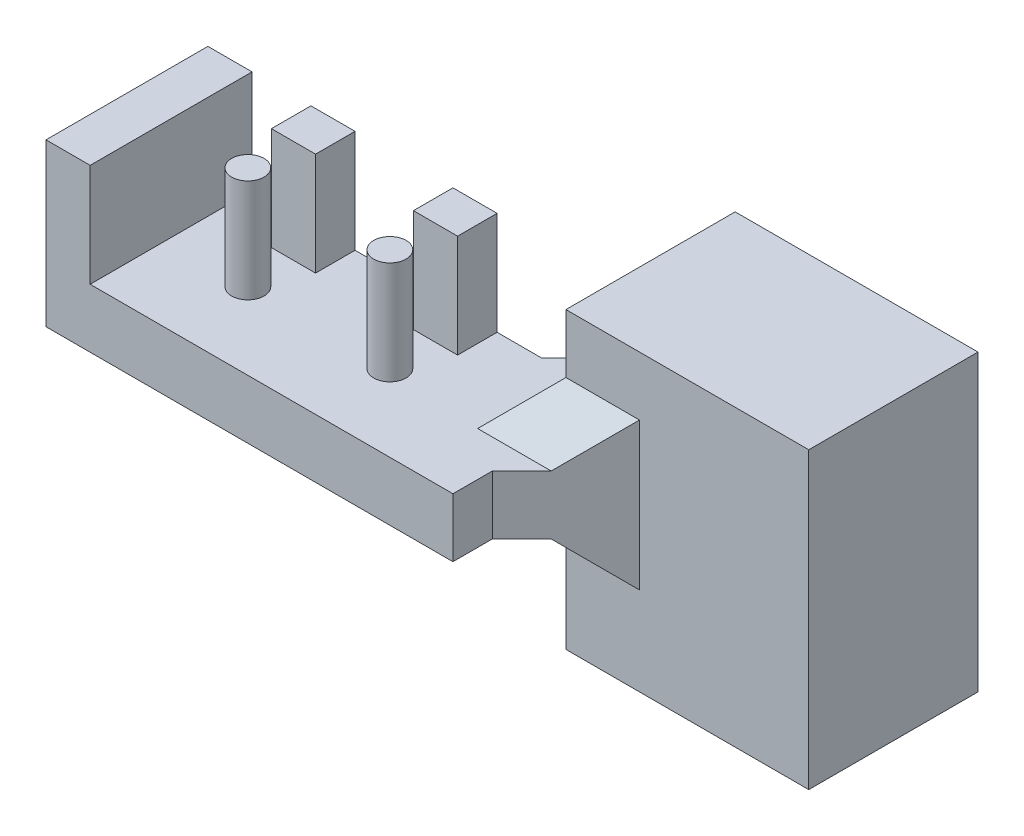
ISO-10303-21;
HEADER;
FILE_DESCRIPTION(('STEP AP214'),'2;1');
FILE_NAME('part.step','',(''),(''),'','','');
FILE_SCHEMA(('AUTOMOTIVE_DESIGN { 1 0 10303 214 1 1 1 1 }'));
ENDSEC;
DATA;
#1=APPLICATION_CONTEXT('core data for automotive mechanical design processes');
#2=APPLICATION_PROTOCOL_DEFINITION('international standard','automotive_design',2000,#1);
#3=PRODUCT_CONTEXT('',#1,'mechanical');
#4=PRODUCT('Part','Part','',(#3));
#5=PRODUCT_RELATED_PRODUCT_CATEGORY('part','',(#4));
#6=PRODUCT_DEFINITION_FORMATION('','',#4);
#7=PRODUCT_DEFINITION_CONTEXT('part definition',#1,'design');
#8=PRODUCT_DEFINITION('design','',#6,#7);
#9=PRODUCT_DEFINITION_SHAPE('','',#8);
#10=(LENGTH_UNIT() NAMED_UNIT(*) SI_UNIT(.MILLI.,.METRE.));
#11=(NAMED_UNIT(*) PLANE_ANGLE_UNIT() SI_UNIT($,.RADIAN.));
#12=(NAMED_UNIT(*) SI_UNIT($,.STERADIAN.) SOLID_ANGLE_UNIT());
#13=UNCERTAINTY_MEASURE_WITH_UNIT(LENGTH_MEASURE(1.E-05),#10,'distance_accuracy_value','');
#14=(GEOMETRIC_REPRESENTATION_CONTEXT(3) GLOBAL_UNCERTAINTY_ASSIGNED_CONTEXT((#13)) GLOBAL_UNIT_ASSIGNED_CONTEXT((#10,
#11,#12)) REPRESENTATION_CONTEXT('',''));
#15=CARTESIAN_POINT('',(0.,0.,0.));
#16=DIRECTION('',(0.,0.,1.));
#17=DIRECTION('',(1.,0.,0.));
#18=AXIS2_PLACEMENT_3D('',#15,#16,#17);
#19=CARTESIAN_POINT('',(0.,13.,0.));
#20=DIRECTION('',(0.,1.,0.));
#21=DIRECTION('',(0.,0.,1.));
#22=AXIS2_PLACEMENT_3D('',#19,#20,#21);
#23=PLANE('',#22);
#24=CARTESIAN_POINT('',(-9.50000000000002,13.,2.46));
#25=DIRECTION('',(0.,1.,0.));
#26=DIRECTION('',(0.,0.,1.));
#27=AXIS2_PLACEMENT_3D('',#24,#25,#26);
#28=CIRCLE('',#27,1.1);
#29=CARTESIAN_POINT('',(-9.50000000000002,13.,3.56));
#30=VERTEX_POINT('',#29);
#31=EDGE_CURVE('E417',#30,#30,#28,.T.);
#32=ORIENTED_EDGE('',*,*,#31,.F.);
#33=EDGE_LOOP('',(#32));
#34=FACE_BOUND('',#33,.T.);
#35=CARTESIAN_POINT('',(-19.15,13.,2.46));
#36=DIRECTION('',(0.,1.,0.));
#37=DIRECTION('',(0.,0.,1.));
#38=AXIS2_PLACEMENT_3D('',#35,#36,#37);
#39=CIRCLE('',#38,1.1);
#40=CARTESIAN_POINT('',(-19.15,13.,3.56));
#41=VERTEX_POINT('',#40);
#42=EDGE_CURVE('E408',#41,#41,#39,.T.);
#43=ORIENTED_EDGE('',*,*,#42,.F.);
#44=EDGE_LOOP('',(#43));
#45=FACE_BOUND('',#44,.T.);
#46=DIRECTION('',(1.,0.,0.));
#47=VECTOR('',#46,1.);
#48=CARTESIAN_POINT('',(-11.,13.,-0.640000000000002));
#49=LINE('',#48,#47);
#50=CARTESIAN_POINT('',(-11.,13.,-0.640000000000002));
#51=VERTEX_POINT('',#50);
#52=CARTESIAN_POINT('',(-8.00000000000002,13.,-0.640000000000002));
#53=VERTEX_POINT('',#52);
#54=EDGE_CURVE('E565',#51,#53,#49,.T.);
#55=ORIENTED_EDGE('',*,*,#54,.F.);
#56=DIRECTION('',(0.,0.,1.));
#57=VECTOR('',#56,1.);
#58=CARTESIAN_POINT('',(-11.,13.,-3.324));
#59=LINE('',#58,#57);
#60=CARTESIAN_POINT('',(-11.,13.,-3.324));
#61=VERTEX_POINT('',#60);
#62=EDGE_CURVE('E539',#61,#51,#59,.T.);
#63=ORIENTED_EDGE('',*,*,#62,.F.);
#64=DIRECTION('',(1.,0.,0.));
#65=VECTOR('',#64,1.);
#66=CARTESIAN_POINT('',(0.,13.,-3.324));
#67=LINE('',#66,#65);
#68=CARTESIAN_POINT('',(-17.65,13.,-3.324));
#69=VERTEX_POINT('',#68);
#70=EDGE_CURVE('E425',#69,#61,#67,.T.);
#71=ORIENTED_EDGE('',*,*,#70,.F.);
#72=DIRECTION('',(0.,0.,-1.));
#73=VECTOR('',#72,1.);
#74=CARTESIAN_POINT('',(-17.65,13.,-3.324));
#75=LINE('',#74,#73);
#76=CARTESIAN_POINT('',(-17.65,13.,-0.640000000000002));
#77=VERTEX_POINT('',#76);
#78=EDGE_CURVE('E587',#77,#69,#75,.T.);
#79=ORIENTED_EDGE('',*,*,#78,.F.);
#80=DIRECTION('',(1.,0.,0.));
#81=VECTOR('',#80,1.);
#82=CARTESIAN_POINT('',(-20.65,13.,-0.640000000000002));
#83=LINE('',#82,#81);
#84=CARTESIAN_POINT('',(-20.65,13.,-0.640000000000002));
#85=VERTEX_POINT('',#84);
#86=EDGE_CURVE('E600',#85,#77,#83,.T.);
#87=ORIENTED_EDGE('',*,*,#86,.F.);
#88=DIRECTION('',(0.,0.,1.));
#89=VECTOR('',#88,1.);
#90=CARTESIAN_POINT('',(-20.65,13.,-3.324));
#91=LINE('',#90,#89);
#92=CARTESIAN_POINT('',(-20.65,13.,-3.324));
#93=VERTEX_POINT('',#92);
#94=EDGE_CURVE('E581',#93,#85,#91,.T.);
#95=ORIENTED_EDGE('',*,*,#94,.F.);
#96=CARTESIAN_POINT('',(-24.65,13.,-3.324));
#97=VERTEX_POINT('',#96);
#98=EDGE_CURVE('E420',#97,#93,#67,.T.);
#99=ORIENTED_EDGE('',*,*,#98,.F.);
#100=DIRECTION('',(0.,0.,1.));
#101=VECTOR('',#100,1.);
#102=CARTESIAN_POINT('',(-24.65,13.,-15.8063875921236));
#103=LINE('',#102,#101);
#104=CARTESIAN_POINT('',(-24.65,13.,7.676));
#105=VERTEX_POINT('',#104);
#106=EDGE_CURVE('E517',#97,#105,#103,.T.);
#107=ORIENTED_EDGE('',*,*,#106,.T.);
#108=DIRECTION('',(1.,0.,0.));
#109=VECTOR('',#108,1.);
#110=CARTESIAN_POINT('',(0.,13.,7.676));
#111=LINE('',#110,#109);
#112=CARTESIAN_POINT('',(0.,13.,7.676));
#113=VERTEX_POINT('',#112);
#114=EDGE_CURVE('E424',#105,#113,#111,.T.);
#115=ORIENTED_EDGE('',*,*,#114,.T.);
#116=DIRECTION('',(0.,0.,1.));
#117=VECTOR('',#116,1.);
#118=CARTESIAN_POINT('',(0.,13.,0.));
#119=LINE('',#118,#117);
#120=CARTESIAN_POINT('',(0.,13.,4.99999999999998));
#121=VERTEX_POINT('',#120);
#122=EDGE_CURVE('E430',#121,#113,#119,.T.);
#123=ORIENTED_EDGE('',*,*,#122,.F.);
#124=DIRECTION('',(0.707106781186551,0.,-0.707106781186544));
#125=VECTOR('',#124,1.);
#126=CARTESIAN_POINT('',(5.00000000000002,13.,0.));
#127=LINE('',#126,#125);
#128=CARTESIAN_POINT('',(2.00000000000001,13.,2.99999999999999));
#129=VERTEX_POINT('',#128);
#130=EDGE_CURVE('E348',#121,#129,#127,.T.);
#131=ORIENTED_EDGE('',*,*,#130,.T.);
#132=DIRECTION('',(-1.,0.,0.));
#133=VECTOR('',#132,1.);
#134=CARTESIAN_POINT('',(0.,13.,2.99999999999999));
#135=LINE('',#134,#133);
#136=CARTESIAN_POINT('',(-2.99999999999999,13.,2.99999999999999));
#137=VERTEX_POINT('',#136);
#138=EDGE_CURVE('E376',#129,#137,#135,.T.);
#139=ORIENTED_EDGE('',*,*,#138,.T.);
#140=DIRECTION('',(0.,0.,-1.));
#141=VECTOR('',#140,1.);
#142=CARTESIAN_POINT('',(-2.99999999999999,13.,0.));
#143=LINE('',#142,#141);
#144=CARTESIAN_POINT('',(-2.99999999999999,13.,-5.32400000000002));
#145=VERTEX_POINT('',#144);
#146=EDGE_CURVE('E373',#137,#145,#143,.T.);
#147=ORIENTED_EDGE('',*,*,#146,.T.);
#148=DIRECTION('',(-0.707106781186551,0.,0.707106781186544));
#149=VECTOR('',#148,1.);
#150=CARTESIAN_POINT('',(-5.00000000000002,13.,-3.324));
#151=LINE('',#150,#149);
#152=CARTESIAN_POINT('',(-5.00000000000002,13.,-3.324));
#153=VERTEX_POINT('',#152);
#154=EDGE_CURVE('E341',#145,#153,#151,.T.);
#155=ORIENTED_EDGE('',*,*,#154,.T.);
#156=CARTESIAN_POINT('',(-8.00000000000002,13.,-3.324));
#157=VERTEX_POINT('',#156);
#158=EDGE_CURVE('E426',#157,#153,#67,.T.);
#159=ORIENTED_EDGE('',*,*,#158,.F.);
#160=DIRECTION('',(0.,0.,-1.));
#161=VECTOR('',#160,1.);
#162=CARTESIAN_POINT('',(-8.00000000000002,13.,-3.324));
#163=LINE('',#162,#161);
#164=EDGE_CURVE('E552',#53,#157,#163,.T.);
#165=ORIENTED_EDGE('',*,*,#164,.F.);
#166=EDGE_LOOP('',(#55,#63,#71,#79,#87,#95,#99,#107,#115,#123,#131,#139,#147,#155,#159,#165));
#167=FACE_BOUND('',#166,.T.);
#168=ADVANCED_FACE('F40',(#34,#45,#167),#23,.T.);
#169=CARTESIAN_POINT('',(0.,17.,0.));
#170=DIRECTION('',(1.,0.,0.));
#171=DIRECTION('',(0.,0.,-1.));
#172=AXIS2_PLACEMENT_3D('',#169,#170,#171);
#173=PLANE('',#172);
#174=DIRECTION('',(0.,-1.,0.));
#175=VECTOR('',#174,1.);
#176=CARTESIAN_POINT('',(0.,17.,0.));
#177=LINE('',#176,#175);
#178=CARTESIAN_POINT('',(0.,5.99999999999995,0.));
#179=VERTEX_POINT('',#178);
#180=CARTESIAN_POINT('',(0.,0.,0.));
#181=VERTEX_POINT('',#180);
#182=EDGE_CURVE('E319',#179,#181,#177,.T.);
#183=ORIENTED_EDGE('',*,*,#182,.F.);
#184=DIRECTION('',(0.,0.,-1.));
#185=VECTOR('',#184,1.);
#186=CARTESIAN_POINT('',(0.,5.99999999999995,-8.32399999999998));
#187=LINE('',#186,#185);
#188=CARTESIAN_POINT('',(0.,5.99999999999995,-8.32399999999998));
#189=VERTEX_POINT('',#188);
#190=EDGE_CURVE('E362',#179,#189,#187,.T.);
#191=ORIENTED_EDGE('',*,*,#190,.T.);
#192=DIRECTION('',(0.,1.,0.));
#193=VECTOR('',#192,1.);
#194=CARTESIAN_POINT('',(0.,17.,-8.32399999999998));
#195=LINE('',#194,#193);
#196=CARTESIAN_POINT('',(0.,16.,-8.32399999999998));
#197=VERTEX_POINT('',#196);
#198=EDGE_CURVE('E328',#189,#197,#195,.T.);
#199=ORIENTED_EDGE('',*,*,#198,.T.);
#200=DIRECTION('',(0.,0.,1.));
#201=VECTOR('',#200,1.);
#202=CARTESIAN_POINT('',(0.,16.,0.));
#203=LINE('',#202,#201);
#204=CARTESIAN_POINT('',(0.,16.,0.));
#205=VERTEX_POINT('',#204);
#206=EDGE_CURVE('E359',#197,#205,#203,.T.);
#207=ORIENTED_EDGE('',*,*,#206,.T.);
#208=CARTESIAN_POINT('',(0.,20.,0.));
#209=VERTEX_POINT('',#208);
#210=EDGE_CURVE('E320',#209,#205,#177,.T.);
#211=ORIENTED_EDGE('',*,*,#210,.F.);
#212=DIRECTION('',(0.,0.,1.));
#213=VECTOR('',#212,1.);
#214=CARTESIAN_POINT('',(0.,20.,-11.5));
#215=LINE('',#214,#213);
#216=CARTESIAN_POINT('',(0.,20.,-11.5));
#217=VERTEX_POINT('',#216);
#218=EDGE_CURVE('E443',#217,#209,#215,.T.);
#219=ORIENTED_EDGE('',*,*,#218,.F.);
#220=DIRECTION('',(0.,-1.,0.));
#221=VECTOR('',#220,1.);
#222=CARTESIAN_POINT('',(0.,17.,-11.5));
#223=LINE('',#222,#221);
#224=CARTESIAN_POINT('',(0.,0.,-11.5));
#225=VERTEX_POINT('',#224);
#226=EDGE_CURVE('E307',#217,#225,#223,.T.);
#227=ORIENTED_EDGE('',*,*,#226,.T.);
#228=DIRECTION('',(0.,0.,1.));
#229=VECTOR('',#228,1.);
#230=CARTESIAN_POINT('',(0.,0.,0.));
#231=LINE('',#230,#229);
#232=EDGE_CURVE('E294',#225,#181,#231,.T.);
#233=ORIENTED_EDGE('',*,*,#232,.T.);
#234=EDGE_LOOP('',(#183,#191,#199,#207,#211,#219,#227,#233));
#235=FACE_BOUND('',#234,.T.);
#236=ADVANCED_FACE('F629',(#235),#173,.F.);
#237=CARTESIAN_POINT('',(0.,0.,0.));
#238=DIRECTION('',(0.,-1.,0.));
#239=DIRECTION('',(0.,0.,-1.));
#240=AXIS2_PLACEMENT_3D('',#237,#238,#239);
#241=PLANE('',#240);
#242=ORIENTED_EDGE('',*,*,#232,.F.);
#243=DIRECTION('',(-1.,0.,0.));
#244=VECTOR('',#243,1.);
#245=CARTESIAN_POINT('',(0.,0.,-11.5));
#246=LINE('',#245,#244);
#247=CARTESIAN_POINT('',(16.5,0.,-11.5));
#248=VERTEX_POINT('',#247);
#249=EDGE_CURVE('E304',#248,#225,#246,.T.);
#250=ORIENTED_EDGE('',*,*,#249,.F.);
#251=DIRECTION('',(0.,0.,-1.));
#252=VECTOR('',#251,1.);
#253=CARTESIAN_POINT('',(16.5,0.,0.));
#254=LINE('',#253,#252);
#255=CARTESIAN_POINT('',(16.5,0.,0.));
#256=VERTEX_POINT('',#255);
#257=EDGE_CURVE('E301',#256,#248,#254,.T.);
#258=ORIENTED_EDGE('',*,*,#257,.F.);
#259=DIRECTION('',(1.,0.,0.));
#260=VECTOR('',#259,1.);
#261=CARTESIAN_POINT('',(0.,0.,0.));
#262=LINE('',#261,#260);
#263=EDGE_CURVE('E298',#181,#256,#262,.T.);
#264=ORIENTED_EDGE('',*,*,#263,.F.);
#265=EDGE_LOOP('',(#242,#250,#258,#264));
#266=FACE_BOUND('',#265,.T.);
#267=DIRECTION('',(-1.,0.,0.));
#268=VECTOR('',#267,1.);
#269=CARTESIAN_POINT('',(3.,0.,-8.5));
#270=LINE('',#269,#268);
#271=CARTESIAN_POINT('',(13.5,0.,-8.5));
#272=VERTEX_POINT('',#271);
#273=CARTESIAN_POINT('',(3.,0.,-8.5));
#274=VERTEX_POINT('',#273);
#275=EDGE_CURVE('E286',#272,#274,#270,.T.);
#276=ORIENTED_EDGE('',*,*,#275,.T.);
#277=DIRECTION('',(0.,0.,1.));
#278=VECTOR('',#277,1.);
#279=CARTESIAN_POINT('',(3.,0.,-3.));
#280=LINE('',#279,#278);
#281=CARTESIAN_POINT('',(3.,0.,-3.));
#282=VERTEX_POINT('',#281);
#283=EDGE_CURVE('E274',#274,#282,#280,.T.);
#284=ORIENTED_EDGE('',*,*,#283,.T.);
#285=DIRECTION('',(1.,0.,0.));
#286=VECTOR('',#285,1.);
#287=CARTESIAN_POINT('',(3.,0.,-3.));
#288=LINE('',#287,#286);
#289=CARTESIAN_POINT('',(13.5,0.,-3.));
#290=VERTEX_POINT('',#289);
#291=EDGE_CURVE('E474',#282,#290,#288,.T.);
#292=ORIENTED_EDGE('',*,*,#291,.T.);
#293=DIRECTION('',(0.,0.,-1.));
#294=VECTOR('',#293,1.);
#295=CARTESIAN_POINT('',(13.5,0.,-3.));
#296=LINE('',#295,#294);
#297=EDGE_CURVE('E477',#290,#272,#296,.T.);
#298=ORIENTED_EDGE('',*,*,#297,.T.);
#299=EDGE_LOOP('',(#276,#284,#292,#298));
#300=FACE_BOUND('',#299,.T.);
#301=ADVANCED_FACE('F483',(#266,#300),#241,.T.);
#302=CARTESIAN_POINT('',(0.,17.,0.));
#303=DIRECTION('',(0.,0.,-1.));
#304=DIRECTION('',(-1.,0.,0.));
#305=AXIS2_PLACEMENT_3D('',#302,#303,#304);
#306=PLANE('',#305);
#307=DIRECTION('',(0.,-1.,0.));
#308=VECTOR('',#307,1.);
#309=CARTESIAN_POINT('',(5.00000000000002,17.,0.));
#310=LINE('',#309,#308);
#311=CARTESIAN_POINT('',(5.00000000000002,16.,0.));
#312=VERTEX_POINT('',#311);
#313=CARTESIAN_POINT('',(5.00000000000002,5.99999999999995,0.));
#314=VERTEX_POINT('',#313);
#315=EDGE_CURVE('E331',#312,#314,#310,.T.);
#316=ORIENTED_EDGE('',*,*,#315,.T.);
#317=DIRECTION('',(-1.,0.,0.));
#318=VECTOR('',#317,1.);
#319=CARTESIAN_POINT('',(0.,5.99999999999995,0.));
#320=LINE('',#319,#318);
#321=EDGE_CURVE('E370',#314,#179,#320,.T.);
#322=ORIENTED_EDGE('',*,*,#321,.T.);
#323=ORIENTED_EDGE('',*,*,#182,.T.);
#324=ORIENTED_EDGE('',*,*,#263,.T.);
#325=DIRECTION('',(0.,-1.,0.));
#326=VECTOR('',#325,1.);
#327=CARTESIAN_POINT('',(16.5,17.,0.));
#328=LINE('',#327,#326);
#329=CARTESIAN_POINT('',(16.5,20.,0.));
#330=VERTEX_POINT('',#329);
#331=EDGE_CURVE('E315',#330,#256,#328,.T.);
#332=ORIENTED_EDGE('',*,*,#331,.F.);
#333=DIRECTION('',(1.,0.,0.));
#334=VECTOR('',#333,1.);
#335=CARTESIAN_POINT('',(0.,20.,0.));
#336=LINE('',#335,#334);
#337=EDGE_CURVE('E447',#209,#330,#336,.T.);
#338=ORIENTED_EDGE('',*,*,#337,.F.);
#339=ORIENTED_EDGE('',*,*,#210,.T.);
#340=DIRECTION('',(1.,0.,0.));
#341=VECTOR('',#340,1.);
#342=CARTESIAN_POINT('',(0.,16.,0.));
#343=LINE('',#342,#341);
#344=EDGE_CURVE('E366',#205,#312,#343,.T.);
#345=ORIENTED_EDGE('',*,*,#344,.T.);
#346=EDGE_LOOP('',(#316,#322,#323,#324,#332,#338,#339,#345));
#347=FACE_BOUND('',#346,.T.);
#348=ADVANCED_FACE('F777',(#347),#306,.F.);
#349=CARTESIAN_POINT('',(16.5,17.,0.));
#350=DIRECTION('',(-1.,0.,0.));
#351=DIRECTION('',(0.,0.,1.));
#352=AXIS2_PLACEMENT_3D('',#349,#350,#351);
#353=PLANE('',#352);
#354=ORIENTED_EDGE('',*,*,#257,.T.);
#355=DIRECTION('',(0.,-1.,0.));
#356=VECTOR('',#355,1.);
#357=CARTESIAN_POINT('',(16.5,17.,-11.5));
#358=LINE('',#357,#356);
#359=CARTESIAN_POINT('',(16.5,20.,-11.5));
#360=VERTEX_POINT('',#359);
#361=EDGE_CURVE('E311',#360,#248,#358,.T.);
#362=ORIENTED_EDGE('',*,*,#361,.F.);
#363=DIRECTION('',(0.,0.,-1.));
#364=VECTOR('',#363,1.);
#365=CARTESIAN_POINT('',(16.5,20.,-11.5));
#366=LINE('',#365,#364);
#367=EDGE_CURVE('E451',#330,#360,#366,.T.);
#368=ORIENTED_EDGE('',*,*,#367,.F.);
#369=ORIENTED_EDGE('',*,*,#331,.T.);
#370=EDGE_LOOP('',(#354,#362,#368,#369));
#371=FACE_BOUND('',#370,.T.);
#372=ADVANCED_FACE('F781',(#371),#353,.F.);
#373=CARTESIAN_POINT('',(0.,17.,-11.5));
#374=DIRECTION('',(0.,0.,1.));
#375=DIRECTION('',(1.,0.,0.));
#376=AXIS2_PLACEMENT_3D('',#373,#374,#375);
#377=PLANE('',#376);
#378=DIRECTION('',(1.,0.,0.));
#379=VECTOR('',#378,1.);
#380=CARTESIAN_POINT('',(13.5,17.,-11.5));
#381=LINE('',#380,#379);
#382=CARTESIAN_POINT('',(3.,17.,-11.5));
#383=VERTEX_POINT('',#382);
#384=CARTESIAN_POINT('',(13.5,17.,-11.5));
#385=VERTEX_POINT('',#384);
#386=EDGE_CURVE('E492',#383,#385,#381,.T.);
#387=ORIENTED_EDGE('',*,*,#386,.F.);
#388=DIRECTION('',(0.,1.,0.));
#389=VECTOR('',#388,1.);
#390=CARTESIAN_POINT('',(3.,17.,-11.5));
#391=LINE('',#390,#389);
#392=CARTESIAN_POINT('',(3.,15.5,-11.5));
#393=VERTEX_POINT('',#392);
#394=EDGE_CURVE('E488',#393,#383,#391,.T.);
#395=ORIENTED_EDGE('',*,*,#394,.F.);
#396=DIRECTION('',(-1.,0.,0.));
#397=VECTOR('',#396,1.);
#398=CARTESIAN_POINT('',(13.5,15.5,-11.5));
#399=LINE('',#398,#397);
#400=CARTESIAN_POINT('',(13.5,15.5,-11.5));
#401=VERTEX_POINT('',#400);
#402=EDGE_CURVE('E254',#401,#393,#399,.T.);
#403=ORIENTED_EDGE('',*,*,#402,.F.);
#404=DIRECTION('',(0.,-1.,0.));
#405=VECTOR('',#404,1.);
#406=CARTESIAN_POINT('',(13.5,17.,-11.5));
#407=LINE('',#406,#405);
#408=EDGE_CURVE('E498',#385,#401,#407,.T.);
#409=ORIENTED_EDGE('',*,*,#408,.F.);
#410=EDGE_LOOP('',(#387,#395,#403,#409));
#411=FACE_BOUND('',#410,.T.);
#412=CARTESIAN_POINT('',(8.25,10.5,-11.5));
#413=DIRECTION('',(0.,0.,-1.));
#414=DIRECTION('',(-1.,0.,0.));
#415=AXIS2_PLACEMENT_3D('',#412,#413,#414);
#416=CIRCLE('',#415,2.5);
#417=CARTESIAN_POINT('',(5.75,10.5,-11.5));
#418=VERTEX_POINT('',#417);
#419=EDGE_CURVE('E460',#418,#418,#416,.T.);
#420=ORIENTED_EDGE('',*,*,#419,.F.);
#421=EDGE_LOOP('',(#420));
#422=FACE_BOUND('',#421,.T.);
#423=ORIENTED_EDGE('',*,*,#249,.T.);
#424=ORIENTED_EDGE('',*,*,#226,.F.);
#425=DIRECTION('',(-1.,0.,0.));
#426=VECTOR('',#425,1.);
#427=CARTESIAN_POINT('',(0.,20.,-11.5));
#428=LINE('',#427,#426);
#429=EDGE_CURVE('E455',#360,#217,#428,.T.);
#430=ORIENTED_EDGE('',*,*,#429,.F.);
#431=ORIENTED_EDGE('',*,*,#361,.T.);
#432=EDGE_LOOP('',(#423,#424,#430,#431));
#433=FACE_BOUND('',#432,.T.);
#434=ADVANCED_FACE('F495',(#411,#422,#433),#377,.F.);
#435=CARTESIAN_POINT('',(3.,17.,-3.));
#436=DIRECTION('',(1.,0.,0.));
#437=DIRECTION('',(0.,0.,-1.));
#438=AXIS2_PLACEMENT_3D('',#435,#436,#437);
#439=PLANE('',#438);
#440=ORIENTED_EDGE('',*,*,#283,.F.);
#441=DIRECTION('',(0.,-1.,0.));
#442=VECTOR('',#441,1.);
#443=CARTESIAN_POINT('',(3.,17.,-8.5));
#444=LINE('',#443,#442);
#445=CARTESIAN_POINT('',(3.,15.5,-8.49999999999999));
#446=VERTEX_POINT('',#445);
#447=EDGE_CURVE('E266',#446,#274,#444,.T.);
#448=ORIENTED_EDGE('',*,*,#447,.F.);
#449=DIRECTION('',(0.,0.,-1.));
#450=VECTOR('',#449,1.);
#451=CARTESIAN_POINT('',(3.,15.5,7.677));
#452=LINE('',#451,#450);
#453=EDGE_CURVE('E248',#446,#393,#452,.T.);
#454=ORIENTED_EDGE('',*,*,#453,.T.);
#455=ORIENTED_EDGE('',*,*,#394,.T.);
#456=DIRECTION('',(0.,0.,1.));
#457=VECTOR('',#456,1.);
#458=CARTESIAN_POINT('',(3.,17.,-3.));
#459=LINE('',#458,#457);
#460=CARTESIAN_POINT('',(3.,17.,-3.));
#461=VERTEX_POINT('',#460);
#462=EDGE_CURVE('E59',#383,#461,#459,.T.);
#463=ORIENTED_EDGE('',*,*,#462,.T.);
#464=DIRECTION('',(0.,-1.,0.));
#465=VECTOR('',#464,1.);
#466=CARTESIAN_POINT('',(3.,17.,-3.));
#467=LINE('',#466,#465);
#468=EDGE_CURVE('E291',#461,#282,#467,.T.);
#469=ORIENTED_EDGE('',*,*,#468,.T.);
#470=EDGE_LOOP('',(#440,#448,#454,#455,#463,#469));
#471=FACE_BOUND('',#470,.T.);
#472=ADVANCED_FACE('F271',(#471),#439,.T.);
#473=CARTESIAN_POINT('',(3.,17.,-3.));
#474=DIRECTION('',(0.,0.,-1.));
#475=DIRECTION('',(-1.,0.,0.));
#476=AXIS2_PLACEMENT_3D('',#473,#474,#475);
#477=PLANE('',#476);
#478=ORIENTED_EDGE('',*,*,#291,.F.);
#479=ORIENTED_EDGE('',*,*,#468,.F.);
#480=DIRECTION('',(1.,0.,0.));
#481=VECTOR('',#480,1.);
#482=CARTESIAN_POINT('',(3.,17.,-3.));
#483=LINE('',#482,#481);
#484=CARTESIAN_POINT('',(13.5,17.,-3.));
#485=VERTEX_POINT('',#484);
#486=EDGE_CURVE('E283',#461,#485,#483,.T.);
#487=ORIENTED_EDGE('',*,*,#486,.T.);
#488=DIRECTION('',(0.,-1.,0.));
#489=VECTOR('',#488,1.);
#490=CARTESIAN_POINT('',(13.5,17.,-3.));
#491=LINE('',#490,#489);
#492=EDGE_CURVE('E281',#485,#290,#491,.T.);
#493=ORIENTED_EDGE('',*,*,#492,.T.);
#494=EDGE_LOOP('',(#478,#479,#487,#493));
#495=FACE_BOUND('',#494,.T.);
#496=ADVANCED_FACE('F486',(#495),#477,.T.);
#497=CARTESIAN_POINT('',(13.5,17.,-3.));
#498=DIRECTION('',(-1.,0.,0.));
#499=DIRECTION('',(0.,0.,1.));
#500=AXIS2_PLACEMENT_3D('',#497,#498,#499);
#501=PLANE('',#500);
#502=ORIENTED_EDGE('',*,*,#297,.F.);
#503=ORIENTED_EDGE('',*,*,#492,.F.);
#504=DIRECTION('',(0.,0.,-1.));
#505=VECTOR('',#504,1.);
#506=CARTESIAN_POINT('',(13.5,17.,-3.));
#507=LINE('',#506,#505);
#508=EDGE_CURVE('E277',#485,#385,#507,.T.);
#509=ORIENTED_EDGE('',*,*,#508,.T.);
#510=ORIENTED_EDGE('',*,*,#408,.T.);
#511=DIRECTION('',(0.,0.,-1.));
#512=VECTOR('',#511,1.);
#513=CARTESIAN_POINT('',(13.5,15.5,7.677));
#514=LINE('',#513,#512);
#515=CARTESIAN_POINT('',(13.5,15.5,-8.5));
#516=VERTEX_POINT('',#515);
#517=EDGE_CURVE('E259',#516,#401,#514,.T.);
#518=ORIENTED_EDGE('',*,*,#517,.F.);
#519=DIRECTION('',(0.,-1.,0.));
#520=VECTOR('',#519,1.);
#521=CARTESIAN_POINT('',(13.5,17.,-8.5));
#522=LINE('',#521,#520);
#523=EDGE_CURVE('E268',#516,#272,#522,.T.);
#524=ORIENTED_EDGE('',*,*,#523,.T.);
#525=EDGE_LOOP('',(#502,#503,#509,#510,#518,#524));
#526=FACE_BOUND('',#525,.T.);
#527=ADVANCED_FACE('F767',(#526),#501,.T.);
#528=CARTESIAN_POINT('',(3.,17.,-8.5));
#529=DIRECTION('',(0.,0.,1.));
#530=DIRECTION('',(1.,0.,0.));
#531=AXIS2_PLACEMENT_3D('',#528,#529,#530);
#532=PLANE('',#531);
#533=DIRECTION('',(-1.,0.,0.));
#534=VECTOR('',#533,1.);
#535=CARTESIAN_POINT('',(13.5,15.5,-8.5));
#536=LINE('',#535,#534);
#537=EDGE_CURVE('E251',#516,#446,#536,.T.);
#538=ORIENTED_EDGE('',*,*,#537,.T.);
#539=ORIENTED_EDGE('',*,*,#447,.T.);
#540=ORIENTED_EDGE('',*,*,#275,.F.);
#541=ORIENTED_EDGE('',*,*,#523,.F.);
#542=EDGE_LOOP('',(#538,#539,#540,#541));
#543=FACE_BOUND('',#542,.T.);
#544=CARTESIAN_POINT('',(8.25,10.5,-8.5));
#545=DIRECTION('',(0.,0.,1.));
#546=DIRECTION('',(1.,0.,0.));
#547=AXIS2_PLACEMENT_3D('',#544,#545,#546);
#548=CIRCLE('',#547,2.5);
#549=CARTESIAN_POINT('',(10.75,10.5,-8.5));
#550=VERTEX_POINT('',#549);
#551=EDGE_CURVE('E459',#550,#550,#548,.F.);
#552=ORIENTED_EDGE('',*,*,#551,.T.);
#553=EDGE_LOOP('',(#552));
#554=FACE_BOUND('',#553,.T.);
#555=ADVANCED_FACE('F263',(#543,#554),#532,.T.);
#556=CARTESIAN_POINT('',(8.25,10.5,0.000999999999999265));
#557=DIRECTION('',(0.,0.,-1.));
#558=DIRECTION('',(-1.,0.,0.));
#559=AXIS2_PLACEMENT_3D('',#556,#557,#558);
#560=CYLINDRICAL_SURFACE('',#559,2.5);
#561=ORIENTED_EDGE('',*,*,#551,.F.);
#562=EDGE_LOOP('',(#561));
#563=FACE_BOUND('',#562,.T.);
#564=ORIENTED_EDGE('',*,*,#419,.T.);
#565=EDGE_LOOP('',(#564));
#566=FACE_BOUND('',#565,.T.);
#567=ADVANCED_FACE('F761',(#563,#566),#560,.F.);
#568=CARTESIAN_POINT('',(0.,17.,0.));
#569=DIRECTION('',(0.,1.,0.));
#570=DIRECTION('',(0.,0.,1.));
#571=AXIS2_PLACEMENT_3D('',#568,#569,#570);
#572=PLANE('',#571);
#573=ORIENTED_EDGE('',*,*,#462,.F.);
#574=ORIENTED_EDGE('',*,*,#386,.T.);
#575=ORIENTED_EDGE('',*,*,#508,.F.);
#576=ORIENTED_EDGE('',*,*,#486,.F.);
#577=EDGE_LOOP('',(#573,#574,#575,#576));
#578=FACE_BOUND('',#577,.T.);
#579=ADVANCED_FACE('F757',(#578),#572,.F.);
#580=CARTESIAN_POINT('',(0.,20.,0.));
#581=DIRECTION('',(0.,1.,0.));
#582=DIRECTION('',(0.,0.,1.));
#583=AXIS2_PLACEMENT_3D('',#580,#581,#582);
#584=PLANE('',#583);
#585=ORIENTED_EDGE('',*,*,#218,.T.);
#586=ORIENTED_EDGE('',*,*,#337,.T.);
#587=ORIENTED_EDGE('',*,*,#367,.T.);
#588=ORIENTED_EDGE('',*,*,#429,.T.);
#589=EDGE_LOOP('',(#585,#586,#587,#588));
#590=FACE_BOUND('',#589,.T.);
#591=ADVANCED_FACE('F750',(#590),#584,.T.);
#592=CARTESIAN_POINT('',(0.,13.,0.));
#593=DIRECTION('',(1.,0.,0.));
#594=DIRECTION('',(0.,0.,-1.));
#595=AXIS2_PLACEMENT_3D('',#592,#593,#594);
#596=PLANE('',#595);
#597=DIRECTION('',(0.,0.,1.));
#598=VECTOR('',#597,1.);
#599=CARTESIAN_POINT('',(0.,9.,0.));
#600=LINE('',#599,#598);
#601=CARTESIAN_POINT('',(0.,9.,4.99999999999998));
#602=VERTEX_POINT('',#601);
#603=CARTESIAN_POINT('',(0.,9.,7.676));
#604=VERTEX_POINT('',#603);
#605=EDGE_CURVE('E437',#602,#604,#600,.T.);
#606=ORIENTED_EDGE('',*,*,#605,.F.);
#607=DIRECTION('',(0.,1.,0.));
#608=VECTOR('',#607,1.);
#609=CARTESIAN_POINT('',(0.,13.,4.99999999999998));
#610=LINE('',#609,#608);
#611=EDGE_CURVE('E334',#602,#121,#610,.T.);
#612=ORIENTED_EDGE('',*,*,#611,.T.);
#613=ORIENTED_EDGE('',*,*,#122,.T.);
#614=DIRECTION('',(0.,-1.,0.));
#615=VECTOR('',#614,1.);
#616=CARTESIAN_POINT('',(0.,13.,7.676));
#617=LINE('',#616,#615);
#618=EDGE_CURVE('E432',#113,#604,#617,.T.);
#619=ORIENTED_EDGE('',*,*,#618,.T.);
#620=EDGE_LOOP('',(#606,#612,#613,#619));
#621=FACE_BOUND('',#620,.T.);
#622=ADVANCED_FACE('F683',(#621),#596,.T.);
#623=CARTESIAN_POINT('',(0.,13.,-3.324));
#624=DIRECTION('',(0.,0.,-1.));
#625=DIRECTION('',(-1.,0.,0.));
#626=AXIS2_PLACEMENT_3D('',#623,#624,#625);
#627=PLANE('',#626);
#628=ORIENTED_EDGE('',*,*,#98,.T.);
#629=DIRECTION('',(0.,-1.,0.));
#630=VECTOR('',#629,1.);
#631=CARTESIAN_POINT('',(-20.65,20.,-3.324));
#632=LINE('',#631,#630);
#633=CARTESIAN_POINT('',(-20.65,20.,-3.324));
#634=VERTEX_POINT('',#633);
#635=EDGE_CURVE('E596',#634,#93,#632,.T.);
#636=ORIENTED_EDGE('',*,*,#635,.F.);
#637=DIRECTION('',(-1.,0.,0.));
#638=VECTOR('',#637,1.);
#639=CARTESIAN_POINT('',(-20.65,20.,-3.324));
#640=LINE('',#639,#638);
#641=CARTESIAN_POINT('',(-17.65,20.,-3.324));
#642=VERTEX_POINT('',#641);
#643=EDGE_CURVE('E593',#642,#634,#640,.T.);
#644=ORIENTED_EDGE('',*,*,#643,.F.);
#645=DIRECTION('',(0.,-1.,0.));
#646=VECTOR('',#645,1.);
#647=CARTESIAN_POINT('',(-17.65,20.,-3.324));
#648=LINE('',#647,#646);
#649=EDGE_CURVE('E608',#642,#69,#648,.T.);
#650=ORIENTED_EDGE('',*,*,#649,.T.);
#651=ORIENTED_EDGE('',*,*,#70,.T.);
#652=DIRECTION('',(0.,-1.,0.));
#653=VECTOR('',#652,1.);
#654=CARTESIAN_POINT('',(-11.,20.,-3.324));
#655=LINE('',#654,#653);
#656=CARTESIAN_POINT('',(-11.,20.,-3.324));
#657=VERTEX_POINT('',#656);
#658=EDGE_CURVE('E561',#657,#61,#655,.T.);
#659=ORIENTED_EDGE('',*,*,#658,.F.);
#660=DIRECTION('',(-1.,0.,0.));
#661=VECTOR('',#660,1.);
#662=CARTESIAN_POINT('',(-11.,20.,-3.324));
#663=LINE('',#662,#661);
#664=CARTESIAN_POINT('',(-8.00000000000002,20.,-3.324));
#665=VERTEX_POINT('',#664);
#666=EDGE_CURVE('E558',#665,#657,#663,.T.);
#667=ORIENTED_EDGE('',*,*,#666,.F.);
#668=DIRECTION('',(0.,-1.,0.));
#669=VECTOR('',#668,1.);
#670=CARTESIAN_POINT('',(-8.00000000000002,20.,-3.324));
#671=LINE('',#670,#669);
#672=EDGE_CURVE('E67',#665,#157,#671,.T.);
#673=ORIENTED_EDGE('',*,*,#672,.T.);
#674=ORIENTED_EDGE('',*,*,#158,.T.);
#675=DIRECTION('',(0.,-1.,0.));
#676=VECTOR('',#675,1.);
#677=CARTESIAN_POINT('',(-5.00000000000002,13.,-3.324));
#678=LINE('',#677,#676);
#679=CARTESIAN_POINT('',(-5.00000000000002,9.,-3.324));
#680=VERTEX_POINT('',#679);
#681=EDGE_CURVE('E324',#153,#680,#678,.T.);
#682=ORIENTED_EDGE('',*,*,#681,.T.);
#683=DIRECTION('',(1.,0.,0.));
#684=VECTOR('',#683,1.);
#685=CARTESIAN_POINT('',(0.,9.,-3.324));
#686=LINE('',#685,#684);
#687=CARTESIAN_POINT('',(-27.65,9.,-3.324));
#688=VERTEX_POINT('',#687);
#689=EDGE_CURVE('E389',#688,#680,#686,.T.);
#690=ORIENTED_EDGE('',*,*,#689,.F.);
#691=DIRECTION('',(0.,-1.,0.));
#692=VECTOR('',#691,1.);
#693=CARTESIAN_POINT('',(-27.65,20.,-3.324));
#694=LINE('',#693,#692);
#695=CARTESIAN_POINT('',(-27.65,20.,-3.324));
#696=VERTEX_POINT('',#695);
#697=EDGE_CURVE('E521',#696,#688,#694,.T.);
#698=ORIENTED_EDGE('',*,*,#697,.F.);
#699=DIRECTION('',(-1.,0.,0.));
#700=VECTOR('',#699,1.);
#701=CARTESIAN_POINT('',(-24.65,20.,-3.324));
#702=LINE('',#701,#700);
#703=CARTESIAN_POINT('',(-24.65,20.,-3.324));
#704=VERTEX_POINT('',#703);
#705=EDGE_CURVE('E527',#704,#696,#702,.T.);
#706=ORIENTED_EDGE('',*,*,#705,.F.);
#707=DIRECTION('',(0.,1.,0.));
#708=VECTOR('',#707,1.);
#709=CARTESIAN_POINT('',(-24.65,13.,-3.324));
#710=LINE('',#709,#708);
#711=EDGE_CURVE('E532',#97,#704,#710,.T.);
#712=ORIENTED_EDGE('',*,*,#711,.F.);
#713=EDGE_LOOP('',(#628,#636,#644,#650,#651,#659,#667,#673,#674,#682,#690,#698,#706,#712));
#714=FACE_BOUND('',#713,.T.);
#715=ADVANCED_FACE('F652',(#714),#627,.T.);
#716=CARTESIAN_POINT('',(0.,13.,7.676));
#717=DIRECTION('',(0.,0.,-1.));
#718=DIRECTION('',(-1.,0.,0.));
#719=AXIS2_PLACEMENT_3D('',#716,#717,#718);
#720=PLANE('',#719);
#721=DIRECTION('',(1.,0.,0.));
#722=VECTOR('',#721,1.);
#723=CARTESIAN_POINT('',(0.,9.,7.676));
#724=LINE('',#723,#722);
#725=CARTESIAN_POINT('',(-27.65,9.,7.676));
#726=VERTEX_POINT('',#725);
#727=EDGE_CURVE('E398',#726,#604,#724,.T.);
#728=ORIENTED_EDGE('',*,*,#727,.T.);
#729=ORIENTED_EDGE('',*,*,#618,.F.);
#730=ORIENTED_EDGE('',*,*,#114,.F.);
#731=DIRECTION('',(0.,1.,0.));
#732=VECTOR('',#731,1.);
#733=CARTESIAN_POINT('',(-24.65,13.,7.676));
#734=LINE('',#733,#732);
#735=CARTESIAN_POINT('',(-24.65,20.,7.676));
#736=VERTEX_POINT('',#735);
#737=EDGE_CURVE('E500',#105,#736,#734,.T.);
#738=ORIENTED_EDGE('',*,*,#737,.T.);
#739=DIRECTION('',(-1.,0.,0.));
#740=VECTOR('',#739,1.);
#741=CARTESIAN_POINT('',(-24.65,20.,7.676));
#742=LINE('',#741,#740);
#743=CARTESIAN_POINT('',(-27.65,20.,7.676));
#744=VERTEX_POINT('',#743);
#745=EDGE_CURVE('E504',#736,#744,#742,.T.);
#746=ORIENTED_EDGE('',*,*,#745,.T.);
#747=DIRECTION('',(0.,-1.,0.));
#748=VECTOR('',#747,1.);
#749=CARTESIAN_POINT('',(-27.65,20.,7.676));
#750=LINE('',#749,#748);
#751=EDGE_CURVE('E513',#744,#726,#750,.T.);
#752=ORIENTED_EDGE('',*,*,#751,.T.);
#753=EDGE_LOOP('',(#728,#729,#730,#738,#746,#752));
#754=FACE_BOUND('',#753,.T.);
#755=ADVANCED_FACE('F688',(#754),#720,.F.);
#756=CARTESIAN_POINT('',(0.,9.,0.));
#757=DIRECTION('',(0.,1.,0.));
#758=DIRECTION('',(0.,0.,1.));
#759=AXIS2_PLACEMENT_3D('',#756,#757,#758);
#760=PLANE('',#759);
#761=DIRECTION('',(0.707106781186551,0.,-0.707106781186544));
#762=VECTOR('',#761,1.);
#763=CARTESIAN_POINT('',(-4.16199999999999,9.,-4.16200000000003));
#764=LINE('',#763,#762);
#765=CARTESIAN_POINT('',(-3.00000000000002,9.,-5.32399999999999));
#766=VERTEX_POINT('',#765);
#767=EDGE_CURVE('E337',#680,#766,#764,.T.);
#768=ORIENTED_EDGE('',*,*,#767,.T.);
#769=DIRECTION('',(0.,0.,1.));
#770=VECTOR('',#769,1.);
#771=CARTESIAN_POINT('',(-3.00000000000002,9.,0.));
#772=LINE('',#771,#770);
#773=CARTESIAN_POINT('',(-3.00000000000002,9.,3.00000000000002));
#774=VERTEX_POINT('',#773);
#775=EDGE_CURVE('E355',#766,#774,#772,.T.);
#776=ORIENTED_EDGE('',*,*,#775,.T.);
#777=DIRECTION('',(1.,0.,0.));
#778=VECTOR('',#777,1.);
#779=CARTESIAN_POINT('',(5.00000000000002,9.,3.00000000000002));
#780=LINE('',#779,#778);
#781=CARTESIAN_POINT('',(1.99999999999998,9.,3.00000000000002));
#782=VERTEX_POINT('',#781);
#783=EDGE_CURVE('E352',#774,#782,#780,.T.);
#784=ORIENTED_EDGE('',*,*,#783,.T.);
#785=DIRECTION('',(-0.707106781186551,0.,0.707106781186544));
#786=VECTOR('',#785,1.);
#787=CARTESIAN_POINT('',(2.49999999999999,9.,2.50000000000001));
#788=LINE('',#787,#786);
#789=EDGE_CURVE('E345',#782,#602,#788,.T.);
#790=ORIENTED_EDGE('',*,*,#789,.T.);
#791=ORIENTED_EDGE('',*,*,#605,.T.);
#792=ORIENTED_EDGE('',*,*,#727,.F.);
#793=DIRECTION('',(0.,0.,1.));
#794=VECTOR('',#793,1.);
#795=CARTESIAN_POINT('',(-27.65,9.,-15.8063875921236));
#796=LINE('',#795,#794);
#797=EDGE_CURVE('E525',#688,#726,#796,.T.);
#798=ORIENTED_EDGE('',*,*,#797,.F.);
#799=ORIENTED_EDGE('',*,*,#689,.T.);
#800=EDGE_LOOP('',(#768,#776,#784,#790,#791,#792,#798,#799));
#801=FACE_BOUND('',#800,.T.);
#802=ADVANCED_FACE('F666',(#801),#760,.F.);
#803=CARTESIAN_POINT('',(-5.00000000000002,13.,-3.324));
#804=DIRECTION('',(0.707106781186544,0.,0.707106781186551));
#805=DIRECTION('',(0.,-1.,0.));
#806=AXIS2_PLACEMENT_3D('',#803,#804,#805);
#807=PLANE('',#806);
#808=ORIENTED_EDGE('',*,*,#154,.F.);
#809=DIRECTION('',(0.577350269189626,0.577350269189631,-0.57735026918962));
#810=VECTOR('',#809,1.);
#811=CARTESIAN_POINT('',(-4.33333333333333,11.6666666666666,-3.99066666666669));
#812=LINE('',#811,#810);
#813=EDGE_CURVE('E11',#145,#197,#812,.T.);
#814=ORIENTED_EDGE('',*,*,#813,.T.);
#815=ORIENTED_EDGE('',*,*,#198,.F.);
#816=DIRECTION('',(0.577350269189626,-0.577350269189632,-0.57735026918962));
#817=VECTOR('',#816,1.);
#818=CARTESIAN_POINT('',(-5.66666666666669,11.6666666666667,-2.65733333333334));
#819=LINE('',#818,#817);
#820=EDGE_CURVE('E379',#189,#766,#819,.F.);
#821=ORIENTED_EDGE('',*,*,#820,.T.);
#822=ORIENTED_EDGE('',*,*,#767,.F.);
#823=ORIENTED_EDGE('',*,*,#681,.F.);
#824=EDGE_LOOP('',(#808,#814,#815,#821,#822,#823));
#825=FACE_BOUND('',#824,.T.);
#826=ADVANCED_FACE('F663',(#825),#807,.F.);
#827=CARTESIAN_POINT('',(5.00000000000002,17.,0.));
#828=DIRECTION('',(-0.707106781186544,0.,-0.707106781186551));
#829=DIRECTION('',(0.,-1.,0.));
#830=AXIS2_PLACEMENT_3D('',#827,#828,#829);
#831=PLANE('',#830);
#832=ORIENTED_EDGE('',*,*,#130,.F.);
#833=ORIENTED_EDGE('',*,*,#611,.F.);
#834=ORIENTED_EDGE('',*,*,#789,.F.);
#835=DIRECTION('',(-0.577350269189628,0.577350269189628,0.577350269189622));
#836=VECTOR('',#835,1.);
#837=CARTESIAN_POINT('',(1.33333333333332,9.66666666666666,3.66666666666667));
#838=LINE('',#837,#836);
#839=EDGE_CURVE('E382',#782,#314,#838,.F.);
#840=ORIENTED_EDGE('',*,*,#839,.T.);
#841=ORIENTED_EDGE('',*,*,#315,.F.);
#842=DIRECTION('',(-0.577350269189628,-0.577350269189627,0.577350269189622));
#843=VECTOR('',#842,1.);
#844=CARTESIAN_POINT('',(5.33333333333336,16.3333333333333,-0.333333333333327));
#845=LINE('',#844,#843);
#846=EDGE_CURVE('E51',#312,#129,#845,.T.);
#847=ORIENTED_EDGE('',*,*,#846,.T.);
#848=EDGE_LOOP('',(#832,#833,#834,#840,#841,#847));
#849=FACE_BOUND('',#848,.T.);
#850=ADVANCED_FACE('F680',(#849),#831,.F.);
#851=CARTESIAN_POINT('',(0.,5.99999999999995,0.));
#852=DIRECTION('',(0.,-0.707106781186544,0.707106781186551));
#853=DIRECTION('',(1.,0.,0.));
#854=AXIS2_PLACEMENT_3D('',#851,#852,#853);
#855=PLANE('',#854);
#856=ORIENTED_EDGE('',*,*,#839,.F.);
#857=ORIENTED_EDGE('',*,*,#783,.F.);
#858=DIRECTION('',(0.577350269189624,-0.57735026918963,-0.577350269189624));
#859=VECTOR('',#858,1.);
#860=CARTESIAN_POINT('',(0.,5.99999999999995,0.));
#861=LINE('',#860,#859);
#862=EDGE_CURVE('E387',#179,#774,#861,.F.);
#863=ORIENTED_EDGE('',*,*,#862,.F.);
#864=ORIENTED_EDGE('',*,*,#321,.F.);
#865=EDGE_LOOP('',(#856,#857,#863,#864));
#866=FACE_BOUND('',#865,.T.);
#867=ADVANCED_FACE('F674',(#866),#855,.T.);
#868=CARTESIAN_POINT('',(-3.00000000000002,9.,0.));
#869=DIRECTION('',(-0.707106781186551,-0.707106781186544,0.));
#870=DIRECTION('',(0.,0.,-1.));
#871=AXIS2_PLACEMENT_3D('',#868,#869,#870);
#872=PLANE('',#871);
#873=ORIENTED_EDGE('',*,*,#820,.F.);
#874=ORIENTED_EDGE('',*,*,#190,.F.);
#875=ORIENTED_EDGE('',*,*,#862,.T.);
#876=ORIENTED_EDGE('',*,*,#775,.F.);
#877=EDGE_LOOP('',(#873,#874,#875,#876));
#878=FACE_BOUND('',#877,.T.);
#879=ADVANCED_FACE('F668',(#878),#872,.T.);
#880=CARTESIAN_POINT('',(0.,16.,0.));
#881=DIRECTION('',(0.707106781186551,-0.707106781186544,0.));
#882=DIRECTION('',(0.,0.,1.));
#883=AXIS2_PLACEMENT_3D('',#880,#881,#882);
#884=PLANE('',#883);
#885=ORIENTED_EDGE('',*,*,#813,.F.);
#886=ORIENTED_EDGE('',*,*,#146,.F.);
#887=DIRECTION('',(0.577350269189624,0.577350269189629,-0.577350269189624));
#888=VECTOR('',#887,1.);
#889=CARTESIAN_POINT('',(0.,16.,0.));
#890=LINE('',#889,#888);
#891=EDGE_CURVE('E45',#205,#137,#890,.F.);
#892=ORIENTED_EDGE('',*,*,#891,.F.);
#893=ORIENTED_EDGE('',*,*,#206,.F.);
#894=EDGE_LOOP('',(#885,#886,#892,#893));
#895=FACE_BOUND('',#894,.T.);
#896=ADVANCED_FACE('F43',(#895),#884,.F.);
#897=CARTESIAN_POINT('',(0.,16.,0.));
#898=DIRECTION('',(0.,-0.707106781186544,-0.707106781186551));
#899=DIRECTION('',(1.,0.,0.));
#900=AXIS2_PLACEMENT_3D('',#897,#898,#899);
#901=PLANE('',#900);
#902=ORIENTED_EDGE('',*,*,#891,.T.);
#903=ORIENTED_EDGE('',*,*,#138,.F.);
#904=ORIENTED_EDGE('',*,*,#846,.F.);
#905=ORIENTED_EDGE('',*,*,#344,.F.);
#906=EDGE_LOOP('',(#902,#903,#904,#905));
#907=FACE_BOUND('',#906,.T.);
#908=ADVANCED_FACE('F743',(#907),#901,.F.);
#909=CARTESIAN_POINT('',(-19.15,20.,2.46));
#910=DIRECTION('',(0.,-1.,0.));
#911=DIRECTION('',(0.,0.,-1.));
#912=AXIS2_PLACEMENT_3D('',#909,#910,#911);
#913=CYLINDRICAL_SURFACE('',#912,1.1);
#914=CARTESIAN_POINT('',(-19.15,20.,2.46));
#915=DIRECTION('',(0.,1.,0.));
#916=DIRECTION('',(0.,0.,1.));
#917=AXIS2_PLACEMENT_3D('',#914,#915,#916);
#918=CIRCLE('',#917,1.1);
#919=CARTESIAN_POINT('',(-19.15,20.,3.56));
#920=VERTEX_POINT('',#919);
#921=EDGE_CURVE('E401',#920,#920,#918,.T.);
#922=ORIENTED_EDGE('',*,*,#921,.F.);
#923=EDGE_LOOP('',(#922));
#924=FACE_BOUND('',#923,.T.);
#925=ORIENTED_EDGE('',*,*,#42,.T.);
#926=EDGE_LOOP('',(#925));
#927=FACE_BOUND('',#926,.T.);
#928=ADVANCED_FACE('F741',(#924,#927),#913,.T.);
#929=CARTESIAN_POINT('',(-19.15,20.,2.46));
#930=DIRECTION('',(0.,1.,0.));
#931=DIRECTION('',(0.,0.,1.));
#932=AXIS2_PLACEMENT_3D('',#929,#930,#931);
#933=PLANE('',#932);
#934=ORIENTED_EDGE('',*,*,#921,.T.);
#935=EDGE_LOOP('',(#934));
#936=FACE_BOUND('',#935,.T.);
#937=ADVANCED_FACE('F737',(#936),#933,.T.);
#938=CARTESIAN_POINT('',(-9.50000000000002,20.,2.46));
#939=DIRECTION('',(0.,-1.,0.));
#940=DIRECTION('',(0.,0.,-1.));
#941=AXIS2_PLACEMENT_3D('',#938,#939,#940);
#942=CYLINDRICAL_SURFACE('',#941,1.1);
#943=CARTESIAN_POINT('',(-9.50000000000002,20.,2.46));
#944=DIRECTION('',(0.,1.,0.));
#945=DIRECTION('',(0.,0.,1.));
#946=AXIS2_PLACEMENT_3D('',#943,#944,#945);
#947=CIRCLE('',#946,1.1);
#948=CARTESIAN_POINT('',(-9.50000000000002,20.,3.56));
#949=VERTEX_POINT('',#948);
#950=EDGE_CURVE('E414',#949,#949,#947,.T.);
#951=ORIENTED_EDGE('',*,*,#950,.F.);
#952=EDGE_LOOP('',(#951));
#953=FACE_BOUND('',#952,.T.);
#954=ORIENTED_EDGE('',*,*,#31,.T.);
#955=EDGE_LOOP('',(#954));
#956=FACE_BOUND('',#955,.T.);
#957=ADVANCED_FACE('F625',(#953,#956),#942,.T.);
#958=CARTESIAN_POINT('',(-9.50000000000002,20.,2.46));
#959=DIRECTION('',(0.,1.,0.));
#960=DIRECTION('',(0.,0.,1.));
#961=AXIS2_PLACEMENT_3D('',#958,#959,#960);
#962=PLANE('',#961);
#963=ORIENTED_EDGE('',*,*,#950,.T.);
#964=EDGE_LOOP('',(#963));
#965=FACE_BOUND('',#964,.T.);
#966=ADVANCED_FACE('F731',(#965),#962,.T.);
#967=CARTESIAN_POINT('',(-20.65,20.,-3.324));
#968=DIRECTION('',(1.,0.,0.));
#969=DIRECTION('',(0.,0.,-1.));
#970=AXIS2_PLACEMENT_3D('',#967,#968,#969);
#971=PLANE('',#970);
#972=ORIENTED_EDGE('',*,*,#94,.T.);
#973=DIRECTION('',(0.,-1.,0.));
#974=VECTOR('',#973,1.);
#975=CARTESIAN_POINT('',(-20.65,20.,-0.640000000000002));
#976=LINE('',#975,#974);
#977=CARTESIAN_POINT('',(-20.65,20.,-0.640000000000002));
#978=VERTEX_POINT('',#977);
#979=EDGE_CURVE('E615',#978,#85,#976,.T.);
#980=ORIENTED_EDGE('',*,*,#979,.F.);
#981=DIRECTION('',(0.,0.,1.));
#982=VECTOR('',#981,1.);
#983=CARTESIAN_POINT('',(-20.65,20.,-3.324));
#984=LINE('',#983,#982);
#985=EDGE_CURVE('E582',#634,#978,#984,.T.);
#986=ORIENTED_EDGE('',*,*,#985,.F.);
#987=ORIENTED_EDGE('',*,*,#635,.T.);
#988=EDGE_LOOP('',(#972,#980,#986,#987));
#989=FACE_BOUND('',#988,.T.);
#990=ADVANCED_FACE('F727',(#989),#971,.F.);
#991=CARTESIAN_POINT('',(-20.65,20.,-0.640000000000002));
#992=DIRECTION('',(0.,0.,-1.));
#993=DIRECTION('',(-1.,0.,0.));
#994=AXIS2_PLACEMENT_3D('',#991,#992,#993);
#995=PLANE('',#994);
#996=ORIENTED_EDGE('',*,*,#86,.T.);
#997=DIRECTION('',(0.,-1.,0.));
#998=VECTOR('',#997,1.);
#999=CARTESIAN_POINT('',(-17.65,20.,-0.640000000000002));
#1000=LINE('',#999,#998);
#1001=CARTESIAN_POINT('',(-17.65,20.,-0.640000000000002));
#1002=VERTEX_POINT('',#1001);
#1003=EDGE_CURVE('E611',#1002,#77,#1000,.T.);
#1004=ORIENTED_EDGE('',*,*,#1003,.F.);
#1005=DIRECTION('',(1.,0.,0.));
#1006=VECTOR('',#1005,1.);
#1007=CARTESIAN_POINT('',(-20.65,20.,-0.640000000000002));
#1008=LINE('',#1007,#1006);
#1009=EDGE_CURVE('E586',#978,#1002,#1008,.T.);
#1010=ORIENTED_EDGE('',*,*,#1009,.F.);
#1011=ORIENTED_EDGE('',*,*,#979,.T.);
#1012=EDGE_LOOP('',(#996,#1004,#1010,#1011));
#1013=FACE_BOUND('',#1012,.T.);
#1014=ADVANCED_FACE('F723',(#1013),#995,.F.);
#1015=CARTESIAN_POINT('',(-17.65,20.,-3.324));
#1016=DIRECTION('',(-1.,0.,0.));
#1017=DIRECTION('',(0.,0.,1.));
#1018=AXIS2_PLACEMENT_3D('',#1015,#1016,#1017);
#1019=PLANE('',#1018);
#1020=ORIENTED_EDGE('',*,*,#78,.T.);
#1021=ORIENTED_EDGE('',*,*,#649,.F.);
#1022=DIRECTION('',(0.,0.,-1.));
#1023=VECTOR('',#1022,1.);
#1024=CARTESIAN_POINT('',(-17.65,20.,-3.324));
#1025=LINE('',#1024,#1023);
#1026=EDGE_CURVE('E590',#1002,#642,#1025,.T.);
#1027=ORIENTED_EDGE('',*,*,#1026,.F.);
#1028=ORIENTED_EDGE('',*,*,#1003,.T.);
#1029=EDGE_LOOP('',(#1020,#1021,#1027,#1028));
#1030=FACE_BOUND('',#1029,.T.);
#1031=ADVANCED_FACE('F719',(#1030),#1019,.F.);
#1032=CARTESIAN_POINT('',(0.,20.,0.));
#1033=DIRECTION('',(0.,1.,0.));
#1034=DIRECTION('',(0.,0.,1.));
#1035=AXIS2_PLACEMENT_3D('',#1032,#1033,#1034);
#1036=PLANE('',#1035);
#1037=ORIENTED_EDGE('',*,*,#985,.T.);
#1038=ORIENTED_EDGE('',*,*,#1009,.T.);
#1039=ORIENTED_EDGE('',*,*,#1026,.T.);
#1040=ORIENTED_EDGE('',*,*,#643,.T.);
#1041=EDGE_LOOP('',(#1037,#1038,#1039,#1040));
#1042=FACE_BOUND('',#1041,.T.);
#1043=ADVANCED_FACE('F716',(#1042),#1036,.T.);
#1044=CARTESIAN_POINT('',(-11.,20.,-3.324));
#1045=DIRECTION('',(1.,0.,0.));
#1046=DIRECTION('',(0.,0.,-1.));
#1047=AXIS2_PLACEMENT_3D('',#1044,#1045,#1046);
#1048=PLANE('',#1047);
#1049=ORIENTED_EDGE('',*,*,#62,.T.);
#1050=DIRECTION('',(0.,-1.,0.));
#1051=VECTOR('',#1050,1.);
#1052=CARTESIAN_POINT('',(-11.,20.,-0.640000000000002));
#1053=LINE('',#1052,#1051);
#1054=CARTESIAN_POINT('',(-11.,20.,-0.640000000000002));
#1055=VERTEX_POINT('',#1054);
#1056=EDGE_CURVE('E578',#1055,#51,#1053,.T.);
#1057=ORIENTED_EDGE('',*,*,#1056,.F.);
#1058=DIRECTION('',(0.,0.,1.));
#1059=VECTOR('',#1058,1.);
#1060=CARTESIAN_POINT('',(-11.,20.,-3.324));
#1061=LINE('',#1060,#1059);
#1062=EDGE_CURVE('E547',#657,#1055,#1061,.T.);
#1063=ORIENTED_EDGE('',*,*,#1062,.F.);
#1064=ORIENTED_EDGE('',*,*,#658,.T.);
#1065=EDGE_LOOP('',(#1049,#1057,#1063,#1064));
#1066=FACE_BOUND('',#1065,.T.);
#1067=ADVANCED_FACE('F651',(#1066),#1048,.F.);
#1068=CARTESIAN_POINT('',(-11.,20.,-0.640000000000002));
#1069=DIRECTION('',(0.,0.,-1.));
#1070=DIRECTION('',(-1.,0.,0.));
#1071=AXIS2_PLACEMENT_3D('',#1068,#1069,#1070);
#1072=PLANE('',#1071);
#1073=ORIENTED_EDGE('',*,*,#54,.T.);
#1074=DIRECTION('',(0.,-1.,0.));
#1075=VECTOR('',#1074,1.);
#1076=CARTESIAN_POINT('',(-8.00000000000002,20.,-0.640000000000002));
#1077=LINE('',#1076,#1075);
#1078=CARTESIAN_POINT('',(-8.00000000000002,20.,-0.640000000000002));
#1079=VERTEX_POINT('',#1078);
#1080=EDGE_CURVE('E574',#1079,#53,#1077,.T.);
#1081=ORIENTED_EDGE('',*,*,#1080,.F.);
#1082=DIRECTION('',(1.,0.,0.));
#1083=VECTOR('',#1082,1.);
#1084=CARTESIAN_POINT('',(-11.,20.,-0.640000000000002));
#1085=LINE('',#1084,#1083);
#1086=EDGE_CURVE('E551',#1055,#1079,#1085,.T.);
#1087=ORIENTED_EDGE('',*,*,#1086,.F.);
#1088=ORIENTED_EDGE('',*,*,#1056,.T.);
#1089=EDGE_LOOP('',(#1073,#1081,#1087,#1088));
#1090=FACE_BOUND('',#1089,.T.);
#1091=ADVANCED_FACE('F641',(#1090),#1072,.F.);
#1092=CARTESIAN_POINT('',(-8.00000000000002,20.,-3.324));
#1093=DIRECTION('',(-1.,0.,0.));
#1094=DIRECTION('',(0.,0.,1.));
#1095=AXIS2_PLACEMENT_3D('',#1092,#1093,#1094);
#1096=PLANE('',#1095);
#1097=ORIENTED_EDGE('',*,*,#164,.T.);
#1098=ORIENTED_EDGE('',*,*,#672,.F.);
#1099=DIRECTION('',(0.,0.,-1.));
#1100=VECTOR('',#1099,1.);
#1101=CARTESIAN_POINT('',(-8.00000000000002,20.,-3.324));
#1102=LINE('',#1101,#1100);
#1103=EDGE_CURVE('E555',#1079,#665,#1102,.T.);
#1104=ORIENTED_EDGE('',*,*,#1103,.F.);
#1105=ORIENTED_EDGE('',*,*,#1080,.T.);
#1106=EDGE_LOOP('',(#1097,#1098,#1104,#1105));
#1107=FACE_BOUND('',#1106,.T.);
#1108=ADVANCED_FACE('F645',(#1107),#1096,.F.);
#1109=CARTESIAN_POINT('',(0.,20.,0.));
#1110=DIRECTION('',(0.,1.,0.));
#1111=DIRECTION('',(0.,0.,1.));
#1112=AXIS2_PLACEMENT_3D('',#1109,#1110,#1111);
#1113=PLANE('',#1112);
#1114=ORIENTED_EDGE('',*,*,#1062,.T.);
#1115=ORIENTED_EDGE('',*,*,#1086,.T.);
#1116=ORIENTED_EDGE('',*,*,#1103,.T.);
#1117=ORIENTED_EDGE('',*,*,#666,.T.);
#1118=EDGE_LOOP('',(#1114,#1115,#1116,#1117));
#1119=FACE_BOUND('',#1118,.T.);
#1120=ADVANCED_FACE('F647',(#1119),#1113,.T.);
#1121=CARTESIAN_POINT('',(-24.65,13.,-15.8063875921236));
#1122=DIRECTION('',(1.,0.,0.));
#1123=DIRECTION('',(0.,0.,-1.));
#1124=AXIS2_PLACEMENT_3D('',#1121,#1122,#1123);
#1125=PLANE('',#1124);
#1126=ORIENTED_EDGE('',*,*,#106,.F.);
#1127=ORIENTED_EDGE('',*,*,#711,.T.);
#1128=DIRECTION('',(0.,0.,1.));
#1129=VECTOR('',#1128,1.);
#1130=CARTESIAN_POINT('',(-24.65,20.,-15.8063875921236));
#1131=LINE('',#1130,#1129);
#1132=EDGE_CURVE('E531',#704,#736,#1131,.T.);
#1133=ORIENTED_EDGE('',*,*,#1132,.T.);
#1134=ORIENTED_EDGE('',*,*,#737,.F.);
#1135=EDGE_LOOP('',(#1126,#1127,#1133,#1134));
#1136=FACE_BOUND('',#1135,.T.);
#1137=ADVANCED_FACE('F699',(#1136),#1125,.T.);
#1138=CARTESIAN_POINT('',(-24.65,20.,-15.8063875921236));
#1139=DIRECTION('',(0.,1.,0.));
#1140=DIRECTION('',(0.,0.,1.));
#1141=AXIS2_PLACEMENT_3D('',#1138,#1139,#1140);
#1142=PLANE('',#1141);
#1143=ORIENTED_EDGE('',*,*,#1132,.F.);
#1144=ORIENTED_EDGE('',*,*,#705,.T.);
#1145=DIRECTION('',(0.,0.,1.));
#1146=VECTOR('',#1145,1.);
#1147=CARTESIAN_POINT('',(-27.65,20.,-15.8063875921236));
#1148=LINE('',#1147,#1146);
#1149=EDGE_CURVE('E526',#696,#744,#1148,.T.);
#1150=ORIENTED_EDGE('',*,*,#1149,.T.);
#1151=ORIENTED_EDGE('',*,*,#745,.F.);
#1152=EDGE_LOOP('',(#1143,#1144,#1150,#1151));
#1153=FACE_BOUND('',#1152,.T.);
#1154=ADVANCED_FACE('F697',(#1153),#1142,.T.);
#1155=CARTESIAN_POINT('',(-27.65,20.,-15.8063875921236));
#1156=DIRECTION('',(-1.,0.,0.));
#1157=DIRECTION('',(0.,0.,1.));
#1158=AXIS2_PLACEMENT_3D('',#1155,#1156,#1157);
#1159=PLANE('',#1158);
#1160=ORIENTED_EDGE('',*,*,#1149,.F.);
#1161=ORIENTED_EDGE('',*,*,#697,.T.);
#1162=ORIENTED_EDGE('',*,*,#797,.T.);
#1163=ORIENTED_EDGE('',*,*,#751,.F.);
#1164=EDGE_LOOP('',(#1160,#1161,#1162,#1163));
#1165=FACE_BOUND('',#1164,.T.);
#1166=ADVANCED_FACE('F692',(#1165),#1159,.T.);
#1167=CARTESIAN_POINT('',(13.5,15.5,7.677));
#1168=DIRECTION('',(0.,-1.,0.));
#1169=DIRECTION('',(0.,0.,-1.));
#1170=AXIS2_PLACEMENT_3D('',#1167,#1168,#1169);
#1171=PLANE('',#1170);
#1172=ORIENTED_EDGE('',*,*,#517,.T.);
#1173=ORIENTED_EDGE('',*,*,#402,.T.);
#1174=ORIENTED_EDGE('',*,*,#453,.F.);
#1175=ORIENTED_EDGE('',*,*,#537,.F.);
#1176=EDGE_LOOP('',(#1172,#1173,#1174,#1175));
#1177=FACE_BOUND('',#1176,.T.);
#1178=ADVANCED_FACE('F250',(#1177),#1171,.F.);
#1179=CLOSED_SHELL('',(#168,#236,#301,#348,#372,#434,#472,#496,#527,#555,#567,#579,#591,#622,
#715,#755,#802,#826,#850,#867,#879,#896,#908,#928,#937,#957,#966,#990,#1014,#1031,#1043,#1067,
#1091,#1108,#1120,#1137,#1154,#1166,#1178));
#1180=MANIFOLD_SOLID_BREP('B2',#1179);
#1181=ADVANCED_BREP_SHAPE_REPRESENTATION('',(#18,#1180),#14);
#1182=SHAPE_DEFINITION_REPRESENTATION(#9,#1181);
ENDSEC;
END-ISO-10303-21;
